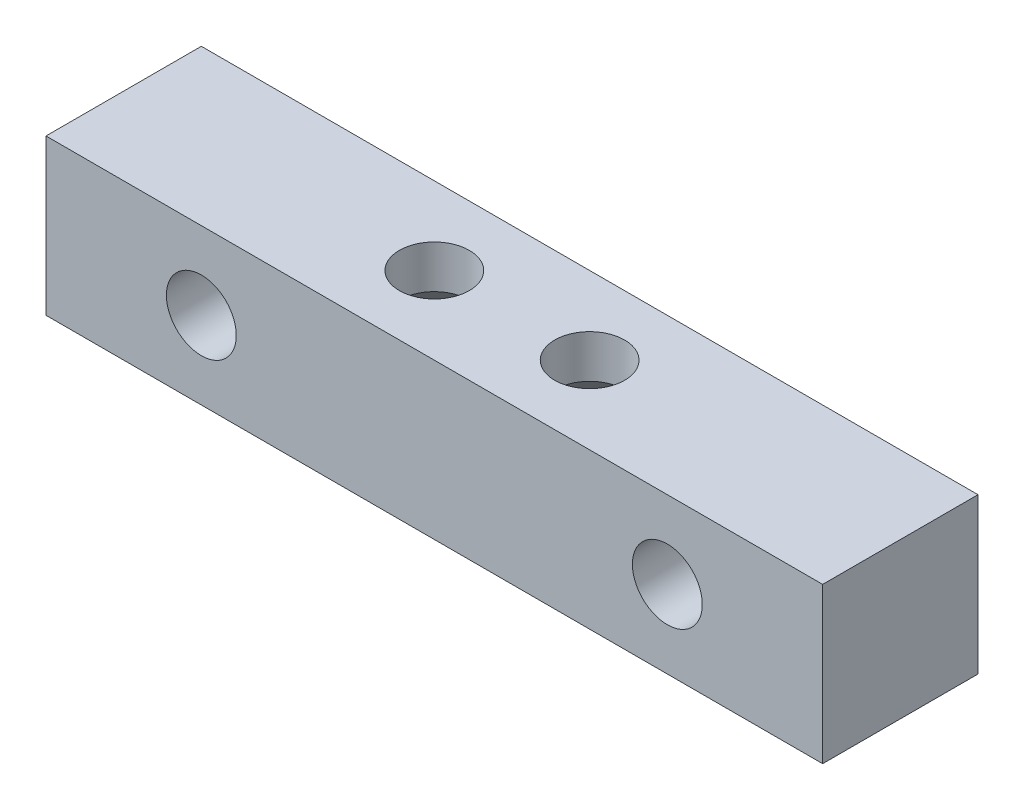
ISO-10303-21;
HEADER;
FILE_DESCRIPTION(('STEP AP214'),'2;1');
FILE_NAME('part.step','',(''),(''),'','','');
FILE_SCHEMA(('AUTOMOTIVE_DESIGN { 1 0 10303 214 1 1 1 1 }'));
ENDSEC;
DATA;
#1=APPLICATION_CONTEXT('core data for automotive mechanical design processes');
#2=APPLICATION_PROTOCOL_DEFINITION('international standard','automotive_design',2000,#1);
#3=PRODUCT_CONTEXT('',#1,'mechanical');
#4=PRODUCT('Part','Part','',(#3));
#5=PRODUCT_RELATED_PRODUCT_CATEGORY('part','',(#4));
#6=PRODUCT_DEFINITION_FORMATION('','',#4);
#7=PRODUCT_DEFINITION_CONTEXT('part definition',#1,'design');
#8=PRODUCT_DEFINITION('design','',#6,#7);
#9=PRODUCT_DEFINITION_SHAPE('','',#8);
#10=(LENGTH_UNIT() NAMED_UNIT(*) SI_UNIT(.MILLI.,.METRE.));
#11=(NAMED_UNIT(*) PLANE_ANGLE_UNIT() SI_UNIT($,.RADIAN.));
#12=(NAMED_UNIT(*) SI_UNIT($,.STERADIAN.) SOLID_ANGLE_UNIT());
#13=UNCERTAINTY_MEASURE_WITH_UNIT(LENGTH_MEASURE(1.E-05),#10,'distance_accuracy_value','');
#14=(GEOMETRIC_REPRESENTATION_CONTEXT(3) GLOBAL_UNCERTAINTY_ASSIGNED_CONTEXT((#13)) GLOBAL_UNIT_ASSIGNED_CONTEXT((#10,
#11,#12)) REPRESENTATION_CONTEXT('',''));
#15=CARTESIAN_POINT('',(0.,0.,0.));
#16=DIRECTION('',(0.,0.,1.));
#17=DIRECTION('',(1.,0.,0.));
#18=AXIS2_PLACEMENT_3D('',#15,#16,#17);
#19=CARTESIAN_POINT('',(-25.,-5.,10.));
#20=DIRECTION('',(0.,1.,0.));
#21=DIRECTION('',(0.,0.,1.));
#22=AXIS2_PLACEMENT_3D('',#19,#20,#21);
#23=PLANE('',#22);
#24=CARTESIAN_POINT('',(5.,-5.,5.));
#25=DIRECTION('',(0.,-1.,0.));
#26=DIRECTION('',(0.,0.,-1.));
#27=AXIS2_PLACEMENT_3D('',#24,#25,#26);
#28=CIRCLE('',#27,4.48);
#29=CARTESIAN_POINT('',(5.,-5.,0.520000000000002));
#30=VERTEX_POINT('',#29);
#31=EDGE_CURVE('E156',#30,#30,#28,.T.);
#32=ORIENTED_EDGE('',*,*,#31,.F.);
#33=EDGE_LOOP('',(#32));
#34=FACE_BOUND('',#33,.T.);
#35=DIRECTION('',(1.,0.,0.));
#36=VECTOR('',#35,1.);
#37=CARTESIAN_POINT('',(-25.,-5.,0.));
#38=LINE('',#37,#36);
#39=CARTESIAN_POINT('',(-25.,-5.,0.));
#40=VERTEX_POINT('',#39);
#41=CARTESIAN_POINT('',(25.,-5.,0.));
#42=VERTEX_POINT('',#41);
#43=EDGE_CURVE('E80',#40,#42,#38,.T.);
#44=ORIENTED_EDGE('',*,*,#43,.T.);
#45=DIRECTION('',(0.,0.,-1.));
#46=VECTOR('',#45,1.);
#47=CARTESIAN_POINT('',(25.,-5.,10.));
#48=LINE('',#47,#46);
#49=CARTESIAN_POINT('',(25.,-5.,10.));
#50=VERTEX_POINT('',#49);
#51=EDGE_CURVE('E104',#50,#42,#48,.T.);
#52=ORIENTED_EDGE('',*,*,#51,.F.);
#53=DIRECTION('',(1.,0.,0.));
#54=VECTOR('',#53,1.);
#55=CARTESIAN_POINT('',(-25.,-5.,10.));
#56=LINE('',#55,#54);
#57=CARTESIAN_POINT('',(-25.,-5.,10.));
#58=VERTEX_POINT('',#57);
#59=EDGE_CURVE('E57',#58,#50,#56,.T.);
#60=ORIENTED_EDGE('',*,*,#59,.F.);
#61=DIRECTION('',(0.,0.,-1.));
#62=VECTOR('',#61,1.);
#63=CARTESIAN_POINT('',(-25.,-5.,10.));
#64=LINE('',#63,#62);
#65=EDGE_CURVE('E99',#58,#40,#64,.T.);
#66=ORIENTED_EDGE('',*,*,#65,.T.);
#67=EDGE_LOOP('',(#44,#52,#60,#66));
#68=FACE_BOUND('',#67,.T.);
#69=CARTESIAN_POINT('',(-5.,-5.,5.));
#70=DIRECTION('',(0.,-1.,0.));
#71=DIRECTION('',(0.,0.,-1.));
#72=AXIS2_PLACEMENT_3D('',#69,#70,#71);
#73=CIRCLE('',#72,4.48);
#74=CARTESIAN_POINT('',(-5.,-5.,0.520000000000002));
#75=VERTEX_POINT('',#74);
#76=EDGE_CURVE('E140',#75,#75,#73,.T.);
#77=ORIENTED_EDGE('',*,*,#76,.F.);
#78=EDGE_LOOP('',(#77));
#79=FACE_BOUND('',#78,.T.);
#80=ADVANCED_FACE('F39',(#34,#68,#79),#23,.F.);
#81=CARTESIAN_POINT('',(25.,-5.,10.));
#82=DIRECTION('',(-1.,0.,0.));
#83=DIRECTION('',(0.,0.,1.));
#84=AXIS2_PLACEMENT_3D('',#81,#82,#83);
#85=PLANE('',#84);
#86=DIRECTION('',(0.,1.,0.));
#87=VECTOR('',#86,1.);
#88=CARTESIAN_POINT('',(25.,-5.,0.));
#89=LINE('',#88,#87);
#90=CARTESIAN_POINT('',(25.,5.,0.));
#91=VERTEX_POINT('',#90);
#92=EDGE_CURVE('E108',#42,#91,#89,.T.);
#93=ORIENTED_EDGE('',*,*,#92,.T.);
#94=DIRECTION('',(0.,0.,-1.));
#95=VECTOR('',#94,1.);
#96=CARTESIAN_POINT('',(25.,5.,10.));
#97=LINE('',#96,#95);
#98=CARTESIAN_POINT('',(25.,5.,10.));
#99=VERTEX_POINT('',#98);
#100=EDGE_CURVE('E11',#99,#91,#97,.T.);
#101=ORIENTED_EDGE('',*,*,#100,.F.);
#102=DIRECTION('',(0.,1.,0.));
#103=VECTOR('',#102,1.);
#104=CARTESIAN_POINT('',(25.,-5.,10.));
#105=LINE('',#104,#103);
#106=EDGE_CURVE('E92',#50,#99,#105,.T.);
#107=ORIENTED_EDGE('',*,*,#106,.F.);
#108=ORIENTED_EDGE('',*,*,#51,.T.);
#109=EDGE_LOOP('',(#93,#101,#107,#108));
#110=FACE_BOUND('',#109,.T.);
#111=ADVANCED_FACE('F41',(#110),#85,.F.);
#112=CARTESIAN_POINT('',(-25.,5.,10.));
#113=DIRECTION('',(0.,-1.,0.));
#114=DIRECTION('',(0.,0.,-1.));
#115=AXIS2_PLACEMENT_3D('',#112,#113,#114);
#116=PLANE('',#115);
#117=CARTESIAN_POINT('',(5.,4.99999999999999,5.));
#118=DIRECTION('',(0.,-1.,0.));
#119=DIRECTION('',(0.,0.,-1.));
#120=AXIS2_PLACEMENT_3D('',#117,#118,#119);
#121=CIRCLE('',#120,2.25000000000001);
#122=CARTESIAN_POINT('',(5.,4.99999999999999,2.74999999999999));
#123=VERTEX_POINT('',#122);
#124=EDGE_CURVE('E144',#123,#123,#121,.T.);
#125=ORIENTED_EDGE('',*,*,#124,.T.);
#126=EDGE_LOOP('',(#125));
#127=FACE_BOUND('',#126,.T.);
#128=CARTESIAN_POINT('',(-5.,4.99999999999999,5.));
#129=DIRECTION('',(0.,-1.,0.));
#130=DIRECTION('',(0.,0.,-1.));
#131=AXIS2_PLACEMENT_3D('',#128,#129,#130);
#132=CIRCLE('',#131,2.25000000000001);
#133=CARTESIAN_POINT('',(-5.,4.99999999999999,2.74999999999999));
#134=VERTEX_POINT('',#133);
#135=EDGE_CURVE('E112',#134,#134,#132,.T.);
#136=ORIENTED_EDGE('',*,*,#135,.T.);
#137=EDGE_LOOP('',(#136));
#138=FACE_BOUND('',#137,.T.);
#139=DIRECTION('',(-1.,0.,0.));
#140=VECTOR('',#139,1.);
#141=CARTESIAN_POINT('',(-25.,5.,0.));
#142=LINE('',#141,#140);
#143=CARTESIAN_POINT('',(-25.,5.,0.));
#144=VERTEX_POINT('',#143);
#145=EDGE_CURVE('E97',#91,#144,#142,.T.);
#146=ORIENTED_EDGE('',*,*,#145,.T.);
#147=DIRECTION('',(0.,0.,-1.));
#148=VECTOR('',#147,1.);
#149=CARTESIAN_POINT('',(-25.,5.,10.));
#150=LINE('',#149,#148);
#151=CARTESIAN_POINT('',(-25.,5.,10.));
#152=VERTEX_POINT('',#151);
#153=EDGE_CURVE('E49',#152,#144,#150,.T.);
#154=ORIENTED_EDGE('',*,*,#153,.F.);
#155=DIRECTION('',(-1.,0.,0.));
#156=VECTOR('',#155,1.);
#157=CARTESIAN_POINT('',(-25.,5.,10.));
#158=LINE('',#157,#156);
#159=EDGE_CURVE('E87',#99,#152,#158,.T.);
#160=ORIENTED_EDGE('',*,*,#159,.F.);
#161=ORIENTED_EDGE('',*,*,#100,.T.);
#162=EDGE_LOOP('',(#146,#154,#160,#161));
#163=FACE_BOUND('',#162,.T.);
#164=ADVANCED_FACE('F96',(#127,#138,#163),#116,.F.);
#165=CARTESIAN_POINT('',(-25.,-5.,10.));
#166=DIRECTION('',(1.,0.,0.));
#167=DIRECTION('',(0.,0.,-1.));
#168=AXIS2_PLACEMENT_3D('',#165,#166,#167);
#169=PLANE('',#168);
#170=DIRECTION('',(0.,-1.,0.));
#171=VECTOR('',#170,1.);
#172=CARTESIAN_POINT('',(-25.,-5.,0.));
#173=LINE('',#172,#171);
#174=EDGE_CURVE('E74',#144,#40,#173,.T.);
#175=ORIENTED_EDGE('',*,*,#174,.T.);
#176=ORIENTED_EDGE('',*,*,#65,.F.);
#177=DIRECTION('',(0.,-1.,0.));
#178=VECTOR('',#177,1.);
#179=CARTESIAN_POINT('',(-25.,-5.,10.));
#180=LINE('',#179,#178);
#181=EDGE_CURVE('E90',#152,#58,#180,.T.);
#182=ORIENTED_EDGE('',*,*,#181,.F.);
#183=ORIENTED_EDGE('',*,*,#153,.T.);
#184=EDGE_LOOP('',(#175,#176,#182,#183));
#185=FACE_BOUND('',#184,.T.);
#186=ADVANCED_FACE('F100',(#185),#169,.F.);
#187=CARTESIAN_POINT('',(0.,0.,10.));
#188=DIRECTION('',(0.,0.,-1.));
#189=DIRECTION('',(-1.,0.,0.));
#190=AXIS2_PLACEMENT_3D('',#187,#188,#189);
#191=PLANE('',#190);
#192=CARTESIAN_POINT('',(15.,0.,10.));
#193=DIRECTION('',(0.,0.,-1.));
#194=DIRECTION('',(-1.,0.,0.));
#195=AXIS2_PLACEMENT_3D('',#192,#193,#194);
#196=CIRCLE('',#195,2.25);
#197=CARTESIAN_POINT('',(12.75,0.,10.));
#198=VERTEX_POINT('',#197);
#199=EDGE_CURVE('E176',#198,#198,#196,.T.);
#200=ORIENTED_EDGE('',*,*,#199,.T.);
#201=EDGE_LOOP('',(#200));
#202=FACE_BOUND('',#201,.T.);
#203=CARTESIAN_POINT('',(-15.,0.,10.));
#204=DIRECTION('',(0.,0.,-1.));
#205=DIRECTION('',(-1.,0.,0.));
#206=AXIS2_PLACEMENT_3D('',#203,#204,#205);
#207=CIRCLE('',#206,2.25);
#208=CARTESIAN_POINT('',(-17.25,0.,10.));
#209=VERTEX_POINT('',#208);
#210=EDGE_CURVE('E160',#209,#209,#207,.T.);
#211=ORIENTED_EDGE('',*,*,#210,.T.);
#212=EDGE_LOOP('',(#211));
#213=FACE_BOUND('',#212,.T.);
#214=ORIENTED_EDGE('',*,*,#106,.T.);
#215=ORIENTED_EDGE('',*,*,#159,.T.);
#216=ORIENTED_EDGE('',*,*,#181,.T.);
#217=ORIENTED_EDGE('',*,*,#59,.T.);
#218=EDGE_LOOP('',(#214,#215,#216,#217));
#219=FACE_BOUND('',#218,.T.);
#220=ADVANCED_FACE('F88',(#202,#213,#219),#191,.F.);
#221=CARTESIAN_POINT('',(0.,0.,0.));
#222=DIRECTION('',(0.,0.,-1.));
#223=DIRECTION('',(-1.,0.,0.));
#224=AXIS2_PLACEMENT_3D('',#221,#222,#223);
#225=PLANE('',#224);
#226=CARTESIAN_POINT('',(15.,0.,0.));
#227=DIRECTION('',(0.,0.,-1.));
#228=DIRECTION('',(-1.,0.,0.));
#229=AXIS2_PLACEMENT_3D('',#226,#227,#228);
#230=CIRCLE('',#229,2.5);
#231=CARTESIAN_POINT('',(12.5,0.,0.));
#232=VERTEX_POINT('',#231);
#233=EDGE_CURVE('E188',#232,#232,#230,.T.);
#234=ORIENTED_EDGE('',*,*,#233,.F.);
#235=EDGE_LOOP('',(#234));
#236=FACE_BOUND('',#235,.T.);
#237=CARTESIAN_POINT('',(-15.,0.,0.));
#238=DIRECTION('',(0.,0.,-1.));
#239=DIRECTION('',(-1.,0.,0.));
#240=AXIS2_PLACEMENT_3D('',#237,#238,#239);
#241=CIRCLE('',#240,2.5);
#242=CARTESIAN_POINT('',(-17.5,0.,0.));
#243=VERTEX_POINT('',#242);
#244=EDGE_CURVE('E172',#243,#243,#241,.T.);
#245=ORIENTED_EDGE('',*,*,#244,.F.);
#246=EDGE_LOOP('',(#245));
#247=FACE_BOUND('',#246,.T.);
#248=ORIENTED_EDGE('',*,*,#92,.F.);
#249=ORIENTED_EDGE('',*,*,#43,.F.);
#250=ORIENTED_EDGE('',*,*,#174,.F.);
#251=ORIENTED_EDGE('',*,*,#145,.F.);
#252=EDGE_LOOP('',(#248,#249,#250,#251));
#253=FACE_BOUND('',#252,.T.);
#254=ADVANCED_FACE('F125',(#236,#247,#253),#225,.T.);
#255=CARTESIAN_POINT('',(-5.,-5.,5.));
#256=DIRECTION('',(0.,-1.,0.));
#257=DIRECTION('',(0.,0.,-1.));
#258=AXIS2_PLACEMENT_3D('',#255,#256,#257);
#259=CYLINDRICAL_SURFACE('',#258,2.25);
#260=ORIENTED_EDGE('',*,*,#135,.F.);
#261=EDGE_LOOP('',(#260));
#262=FACE_BOUND('',#261,.T.);
#263=CARTESIAN_POINT('',(-5.,2.23,5.));
#264=DIRECTION('',(0.,-1.,0.));
#265=DIRECTION('',(0.,0.,-1.));
#266=AXIS2_PLACEMENT_3D('',#263,#264,#265);
#267=CIRCLE('',#266,2.25);
#268=CARTESIAN_POINT('',(-5.,2.23,2.75));
#269=VERTEX_POINT('',#268);
#270=EDGE_CURVE('E132',#269,#269,#267,.T.);
#271=ORIENTED_EDGE('',*,*,#270,.T.);
#272=EDGE_LOOP('',(#271));
#273=FACE_BOUND('',#272,.T.);
#274=ADVANCED_FACE('F197',(#262,#273),#259,.F.);
#275=CARTESIAN_POINT('',(-5.,0.,5.));
#276=DIRECTION('',(0.,-1.,0.));
#277=DIRECTION('',(0.,0.,-1.));
#278=AXIS2_PLACEMENT_3D('',#275,#276,#277);
#279=CONICAL_SURFACE('',#278,4.48,0.785398163397449);
#280=ORIENTED_EDGE('',*,*,#270,.F.);
#281=EDGE_LOOP('',(#280));
#282=FACE_BOUND('',#281,.T.);
#283=CARTESIAN_POINT('',(-5.,0.,5.));
#284=DIRECTION('',(0.,-1.,0.));
#285=DIRECTION('',(0.,0.,-1.));
#286=AXIS2_PLACEMENT_3D('',#283,#284,#285);
#287=CIRCLE('',#286,4.48);
#288=CARTESIAN_POINT('',(-5.,0.,0.520000000000002));
#289=VERTEX_POINT('',#288);
#290=EDGE_CURVE('E136',#289,#289,#287,.T.);
#291=ORIENTED_EDGE('',*,*,#290,.T.);
#292=EDGE_LOOP('',(#291));
#293=FACE_BOUND('',#292,.T.);
#294=ADVANCED_FACE('F238',(#282,#293),#279,.F.);
#295=CARTESIAN_POINT('',(-5.,-5.,5.));
#296=DIRECTION('',(0.,-1.,0.));
#297=DIRECTION('',(0.,0.,-1.));
#298=AXIS2_PLACEMENT_3D('',#295,#296,#297);
#299=CYLINDRICAL_SURFACE('',#298,4.48);
#300=ORIENTED_EDGE('',*,*,#290,.F.);
#301=EDGE_LOOP('',(#300));
#302=FACE_BOUND('',#301,.T.);
#303=ORIENTED_EDGE('',*,*,#76,.T.);
#304=EDGE_LOOP('',(#303));
#305=FACE_BOUND('',#304,.T.);
#306=ADVANCED_FACE('F244',(#302,#305),#299,.F.);
#307=CARTESIAN_POINT('',(5.,-5.,5.));
#308=DIRECTION('',(0.,-1.,0.));
#309=DIRECTION('',(0.,0.,-1.));
#310=AXIS2_PLACEMENT_3D('',#307,#308,#309);
#311=CYLINDRICAL_SURFACE('',#310,2.25);
#312=ORIENTED_EDGE('',*,*,#124,.F.);
#313=EDGE_LOOP('',(#312));
#314=FACE_BOUND('',#313,.T.);
#315=CARTESIAN_POINT('',(5.,2.23,5.));
#316=DIRECTION('',(0.,-1.,0.));
#317=DIRECTION('',(0.,0.,-1.));
#318=AXIS2_PLACEMENT_3D('',#315,#316,#317);
#319=CIRCLE('',#318,2.25);
#320=CARTESIAN_POINT('',(5.,2.23,2.75));
#321=VERTEX_POINT('',#320);
#322=EDGE_CURVE('E148',#321,#321,#319,.T.);
#323=ORIENTED_EDGE('',*,*,#322,.T.);
#324=EDGE_LOOP('',(#323));
#325=FACE_BOUND('',#324,.T.);
#326=ADVANCED_FACE('F250',(#314,#325),#311,.F.);
#327=CARTESIAN_POINT('',(5.,0.,5.));
#328=DIRECTION('',(0.,-1.,0.));
#329=DIRECTION('',(0.,0.,-1.));
#330=AXIS2_PLACEMENT_3D('',#327,#328,#329);
#331=CONICAL_SURFACE('',#330,4.48,0.785398163397449);
#332=ORIENTED_EDGE('',*,*,#322,.F.);
#333=EDGE_LOOP('',(#332));
#334=FACE_BOUND('',#333,.T.);
#335=CARTESIAN_POINT('',(5.,0.,5.));
#336=DIRECTION('',(0.,-1.,0.));
#337=DIRECTION('',(0.,0.,-1.));
#338=AXIS2_PLACEMENT_3D('',#335,#336,#337);
#339=CIRCLE('',#338,4.48);
#340=CARTESIAN_POINT('',(5.,0.,0.520000000000002));
#341=VERTEX_POINT('',#340);
#342=EDGE_CURVE('E152',#341,#341,#339,.T.);
#343=ORIENTED_EDGE('',*,*,#342,.T.);
#344=EDGE_LOOP('',(#343));
#345=FACE_BOUND('',#344,.T.);
#346=ADVANCED_FACE('F256',(#334,#345),#331,.F.);
#347=CARTESIAN_POINT('',(5.,-5.,5.));
#348=DIRECTION('',(0.,-1.,0.));
#349=DIRECTION('',(0.,0.,-1.));
#350=AXIS2_PLACEMENT_3D('',#347,#348,#349);
#351=CYLINDRICAL_SURFACE('',#350,4.48);
#352=ORIENTED_EDGE('',*,*,#342,.F.);
#353=EDGE_LOOP('',(#352));
#354=FACE_BOUND('',#353,.T.);
#355=ORIENTED_EDGE('',*,*,#31,.T.);
#356=EDGE_LOOP('',(#355));
#357=FACE_BOUND('',#356,.T.);
#358=ADVANCED_FACE('F270',(#354,#357),#351,.F.);
#359=CARTESIAN_POINT('',(-15.,0.,0.));
#360=DIRECTION('',(0.,0.,-1.));
#361=DIRECTION('',(-1.,0.,0.));
#362=AXIS2_PLACEMENT_3D('',#359,#360,#361);
#363=CYLINDRICAL_SURFACE('',#362,2.25);
#364=ORIENTED_EDGE('',*,*,#210,.F.);
#365=EDGE_LOOP('',(#364));
#366=FACE_BOUND('',#365,.T.);
#367=CARTESIAN_POINT('',(-15.,0.,4.2));
#368=DIRECTION('',(0.,0.,-1.));
#369=DIRECTION('',(-1.,0.,0.));
#370=AXIS2_PLACEMENT_3D('',#367,#368,#369);
#371=CIRCLE('',#370,2.25);
#372=CARTESIAN_POINT('',(-17.25,0.,4.2));
#373=VERTEX_POINT('',#372);
#374=EDGE_CURVE('E164',#373,#373,#371,.T.);
#375=ORIENTED_EDGE('',*,*,#374,.T.);
#376=EDGE_LOOP('',(#375));
#377=FACE_BOUND('',#376,.T.);
#378=ADVANCED_FACE('F214',(#366,#377),#363,.F.);
#379=CARTESIAN_POINT('',(-12.75,0.,4.2));
#380=DIRECTION('',(0.,0.,1.));
#381=DIRECTION('',(1.,0.,0.));
#382=AXIS2_PLACEMENT_3D('',#379,#380,#381);
#383=PLANE('',#382);
#384=ORIENTED_EDGE('',*,*,#374,.F.);
#385=EDGE_LOOP('',(#384));
#386=FACE_BOUND('',#385,.T.);
#387=CARTESIAN_POINT('',(-15.,0.,4.2));
#388=DIRECTION('',(0.,0.,-1.));
#389=DIRECTION('',(-1.,0.,0.));
#390=AXIS2_PLACEMENT_3D('',#387,#388,#389);
#391=CIRCLE('',#390,2.5);
#392=CARTESIAN_POINT('',(-17.5,0.,4.2));
#393=VERTEX_POINT('',#392);
#394=EDGE_CURVE('E168',#393,#393,#391,.T.);
#395=ORIENTED_EDGE('',*,*,#394,.T.);
#396=EDGE_LOOP('',(#395));
#397=FACE_BOUND('',#396,.T.);
#398=ADVANCED_FACE('F204',(#386,#397),#383,.F.);
#399=CARTESIAN_POINT('',(-15.,0.,0.));
#400=DIRECTION('',(0.,0.,-1.));
#401=DIRECTION('',(-1.,0.,0.));
#402=AXIS2_PLACEMENT_3D('',#399,#400,#401);
#403=CYLINDRICAL_SURFACE('',#402,2.5);
#404=ORIENTED_EDGE('',*,*,#394,.F.);
#405=EDGE_LOOP('',(#404));
#406=FACE_BOUND('',#405,.T.);
#407=ORIENTED_EDGE('',*,*,#244,.T.);
#408=EDGE_LOOP('',(#407));
#409=FACE_BOUND('',#408,.T.);
#410=ADVANCED_FACE('F201',(#406,#409),#403,.F.);
#411=CARTESIAN_POINT('',(15.,0.,0.));
#412=DIRECTION('',(0.,0.,-1.));
#413=DIRECTION('',(-1.,0.,0.));
#414=AXIS2_PLACEMENT_3D('',#411,#412,#413);
#415=CYLINDRICAL_SURFACE('',#414,2.25);
#416=ORIENTED_EDGE('',*,*,#199,.F.);
#417=EDGE_LOOP('',(#416));
#418=FACE_BOUND('',#417,.T.);
#419=CARTESIAN_POINT('',(15.,0.,4.2));
#420=DIRECTION('',(0.,0.,-1.));
#421=DIRECTION('',(-1.,0.,0.));
#422=AXIS2_PLACEMENT_3D('',#419,#420,#421);
#423=CIRCLE('',#422,2.25);
#424=CARTESIAN_POINT('',(12.75,0.,4.2));
#425=VERTEX_POINT('',#424);
#426=EDGE_CURVE('E180',#425,#425,#423,.T.);
#427=ORIENTED_EDGE('',*,*,#426,.T.);
#428=EDGE_LOOP('',(#427));
#429=FACE_BOUND('',#428,.T.);
#430=ADVANCED_FACE('F203',(#418,#429),#415,.F.);
#431=CARTESIAN_POINT('',(17.25,0.,4.2));
#432=DIRECTION('',(0.,0.,1.));
#433=DIRECTION('',(1.,0.,0.));
#434=AXIS2_PLACEMENT_3D('',#431,#432,#433);
#435=PLANE('',#434);
#436=ORIENTED_EDGE('',*,*,#426,.F.);
#437=EDGE_LOOP('',(#436));
#438=FACE_BOUND('',#437,.T.);
#439=CARTESIAN_POINT('',(15.,0.,4.2));
#440=DIRECTION('',(0.,0.,-1.));
#441=DIRECTION('',(-1.,0.,0.));
#442=AXIS2_PLACEMENT_3D('',#439,#440,#441);
#443=CIRCLE('',#442,2.5);
#444=CARTESIAN_POINT('',(12.5,0.,4.2));
#445=VERTEX_POINT('',#444);
#446=EDGE_CURVE('E184',#445,#445,#443,.T.);
#447=ORIENTED_EDGE('',*,*,#446,.T.);
#448=EDGE_LOOP('',(#447));
#449=FACE_BOUND('',#448,.T.);
#450=ADVANCED_FACE('F211',(#438,#449),#435,.F.);
#451=CARTESIAN_POINT('',(15.,0.,0.));
#452=DIRECTION('',(0.,0.,-1.));
#453=DIRECTION('',(-1.,0.,0.));
#454=AXIS2_PLACEMENT_3D('',#451,#452,#453);
#455=CYLINDRICAL_SURFACE('',#454,2.5);
#456=ORIENTED_EDGE('',*,*,#446,.F.);
#457=EDGE_LOOP('',(#456));
#458=FACE_BOUND('',#457,.T.);
#459=ORIENTED_EDGE('',*,*,#233,.T.);
#460=EDGE_LOOP('',(#459));
#461=FACE_BOUND('',#460,.T.);
#462=ADVANCED_FACE('F193',(#458,#461),#455,.F.);
#463=CLOSED_SHELL('',(#80,#111,#164,#186,#220,#254,#274,#294,#306,#326,#346,#358,#378,#398,#410,
#430,#450,#462));
#464=MANIFOLD_SOLID_BREP('B2',#463);
#465=ADVANCED_BREP_SHAPE_REPRESENTATION('',(#18,#464),#14);
#466=SHAPE_DEFINITION_REPRESENTATION(#9,#465);
ENDSEC;
END-ISO-10303-21;
